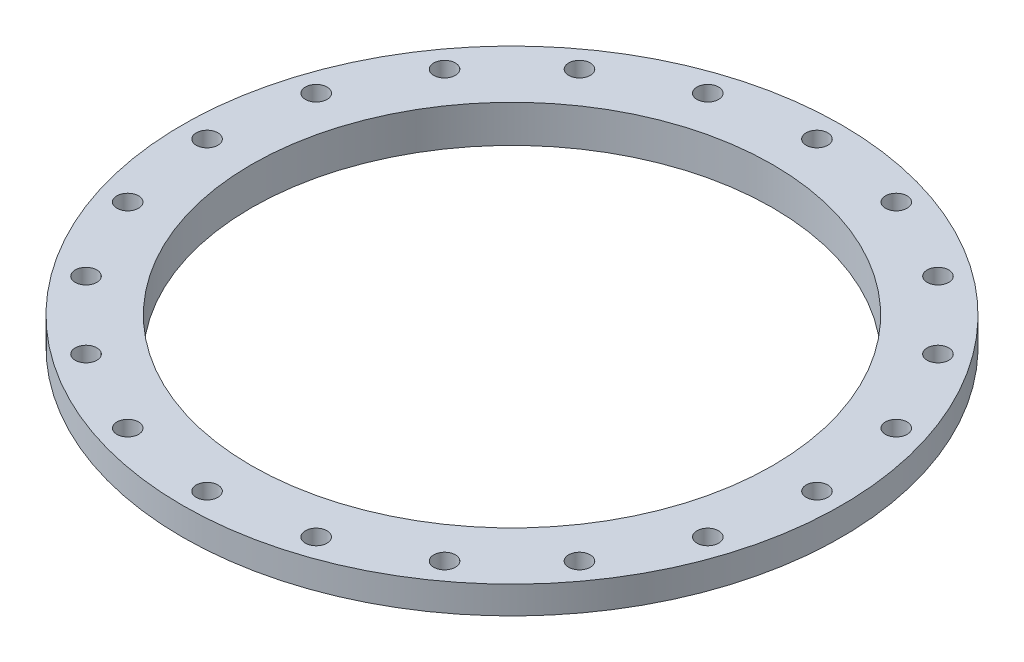
ISO-10303-21;
HEADER;
FILE_DESCRIPTION(('STEP AP214'),'2;1');
FILE_NAME('part.step','',(''),(''),'','','');
FILE_SCHEMA(('AUTOMOTIVE_DESIGN { 1 0 10303 214 1 1 1 1 }'));
ENDSEC;
DATA;
#1=APPLICATION_CONTEXT('core data for automotive mechanical design processes');
#2=APPLICATION_PROTOCOL_DEFINITION('international standard','automotive_design',2000,#1);
#3=PRODUCT_CONTEXT('',#1,'mechanical');
#4=PRODUCT('Part','Part','',(#3));
#5=PRODUCT_RELATED_PRODUCT_CATEGORY('part','',(#4));
#6=PRODUCT_DEFINITION_FORMATION('','',#4);
#7=PRODUCT_DEFINITION_CONTEXT('part definition',#1,'design');
#8=PRODUCT_DEFINITION('design','',#6,#7);
#9=PRODUCT_DEFINITION_SHAPE('','',#8);
#10=(LENGTH_UNIT() NAMED_UNIT(*) SI_UNIT(.MILLI.,.METRE.));
#11=(NAMED_UNIT(*) PLANE_ANGLE_UNIT() SI_UNIT($,.RADIAN.));
#12=(NAMED_UNIT(*) SI_UNIT($,.STERADIAN.) SOLID_ANGLE_UNIT());
#13=UNCERTAINTY_MEASURE_WITH_UNIT(LENGTH_MEASURE(1.E-05),#10,'distance_accuracy_value','');
#14=(GEOMETRIC_REPRESENTATION_CONTEXT(3) GLOBAL_UNCERTAINTY_ASSIGNED_CONTEXT((#13)) GLOBAL_UNIT_ASSIGNED_CONTEXT((#10,
#11,#12)) REPRESENTATION_CONTEXT('',''));
#15=CARTESIAN_POINT('',(0.,0.,0.));
#16=DIRECTION('',(0.,0.,1.));
#17=DIRECTION('',(1.,0.,0.));
#18=AXIS2_PLACEMENT_3D('',#15,#16,#17);
#19=CARTESIAN_POINT('',(0.,19.,-265.));
#20=DIRECTION('',(0.,1.,0.));
#21=DIRECTION('',(0.,0.,-1.));
#22=AXIS2_PLACEMENT_3D('',#19,#20,#21);
#23=PLANE('',#22);
#24=CARTESIAN_POINT('',(-294.827520051493,18.9999999999999,-95.7952682562064));
#25=DIRECTION('',(0.,1.,0.));
#26=DIRECTION('',(0.,0.,1.));
#27=AXIS2_PLACEMENT_3D('',#24,#25,#26);
#28=CIRCLE('',#27,11.);
#29=CARTESIAN_POINT('',(-294.827520051493,18.9999999999999,-84.7952682562064));
#30=VERTEX_POINT('',#29);
#31=EDGE_CURVE('E239',#30,#30,#28,.T.);
#32=ORIENTED_EDGE('',*,*,#31,.F.);
#33=EDGE_LOOP('',(#32));
#34=FACE_BOUND('',#33,.T.);
#35=CARTESIAN_POINT('',(-309.99999999999,18.9999999999999,3.16175115773912E-11));
#36=DIRECTION('',(0.,1.,0.));
#37=DIRECTION('',(0.,0.,1.));
#38=AXIS2_PLACEMENT_3D('',#35,#36,#37);
#39=CIRCLE('',#38,11.);
#40=CARTESIAN_POINT('',(-309.99999999999,18.9999999999999,11.0000000000317));
#41=VERTEX_POINT('',#40);
#42=EDGE_CURVE('E243',#41,#41,#39,.T.);
#43=ORIENTED_EDGE('',*,*,#42,.F.);
#44=EDGE_LOOP('',(#43));
#45=FACE_BOUND('',#44,.T.);
#46=CARTESIAN_POINT('',(-294.82752005148,18.9999999999999,95.7952682562676));
#47=DIRECTION('',(0.,1.,0.));
#48=DIRECTION('',(0.,0.,1.));
#49=AXIS2_PLACEMENT_3D('',#46,#47,#48);
#50=CIRCLE('',#49,11.);
#51=CARTESIAN_POINT('',(-294.82752005148,18.9999999999999,106.795268256268));
#52=VERTEX_POINT('',#51);
#53=EDGE_CURVE('E267',#52,#52,#50,.T.);
#54=ORIENTED_EDGE('',*,*,#53,.F.);
#55=EDGE_LOOP('',(#54));
#56=FACE_BOUND('',#55,.T.);
#57=CARTESIAN_POINT('',(-250.795268256209,18.9999999999999,182.213428210701));
#58=DIRECTION('',(0.,1.,0.));
#59=DIRECTION('',(0.,0.,1.));
#60=AXIS2_PLACEMENT_3D('',#57,#58,#59);
#61=CIRCLE('',#60,11.);
#62=CARTESIAN_POINT('',(-250.795268256209,18.9999999999999,193.213428210701));
#63=VERTEX_POINT('',#62);
#64=EDGE_CURVE('E264',#63,#63,#61,.T.);
#65=ORIENTED_EDGE('',*,*,#64,.F.);
#66=EDGE_LOOP('',(#65));
#67=FACE_BOUND('',#66,.T.);
#68=CARTESIAN_POINT('',(-182.213428210635,18.9999999999999,250.795268256265));
#69=DIRECTION('',(0.,1.,0.));
#70=DIRECTION('',(0.,0.,1.));
#71=AXIS2_PLACEMENT_3D('',#68,#69,#70);
#72=CIRCLE('',#71,11.);
#73=CARTESIAN_POINT('',(-182.213428210635,18.9999999999999,261.795268256265));
#74=VERTEX_POINT('',#73);
#75=EDGE_CURVE('E261',#74,#74,#72,.T.);
#76=ORIENTED_EDGE('',*,*,#75,.F.);
#77=EDGE_LOOP('',(#76));
#78=FACE_BOUND('',#77,.T.);
#79=CARTESIAN_POINT('',(-95.7952682561963,18.9999999999999,294.827520051525));
#80=DIRECTION('',(0.,1.,0.));
#81=DIRECTION('',(0.,0.,1.));
#82=AXIS2_PLACEMENT_3D('',#79,#80,#81);
#83=CIRCLE('',#82,11.);
#84=CARTESIAN_POINT('',(-95.7952682561963,18.9999999999999,305.827520051525));
#85=VERTEX_POINT('',#84);
#86=EDGE_CURVE('E258',#85,#85,#83,.T.);
#87=ORIENTED_EDGE('',*,*,#86,.F.);
#88=EDGE_LOOP('',(#87));
#89=FACE_BOUND('',#88,.T.);
#90=CARTESIAN_POINT('',(4.17618170672537E-11,18.9999999999999,310.000000000021));
#91=DIRECTION('',(0.,1.,0.));
#92=DIRECTION('',(0.,0.,1.));
#93=AXIS2_PLACEMENT_3D('',#90,#91,#92);
#94=CIRCLE('',#93,11.);
#95=CARTESIAN_POINT('',(4.17618170672537E-11,18.9999999999999,321.000000000021));
#96=VERTEX_POINT('',#95);
#97=EDGE_CURVE('E255',#96,#96,#94,.T.);
#98=ORIENTED_EDGE('',*,*,#97,.F.);
#99=EDGE_LOOP('',(#98));
#100=FACE_BOUND('',#99,.T.);
#101=CARTESIAN_POINT('',(95.7952682562777,18.9999999999999,294.827520051512));
#102=DIRECTION('',(0.,1.,0.));
#103=DIRECTION('',(0.,0.,1.));
#104=AXIS2_PLACEMENT_3D('',#101,#102,#103);
#105=CIRCLE('',#104,11.);
#106=CARTESIAN_POINT('',(95.7952682562777,18.9999999999999,305.827520051512));
#107=VERTEX_POINT('',#106);
#108=EDGE_CURVE('E251',#107,#107,#105,.T.);
#109=ORIENTED_EDGE('',*,*,#108,.F.);
#110=EDGE_LOOP('',(#109));
#111=FACE_BOUND('',#110,.T.);
#112=CARTESIAN_POINT('',(182.213428210711,18.9999999999999,250.795268256241));
#113=DIRECTION('',(0.,1.,0.));
#114=DIRECTION('',(0.,0.,1.));
#115=AXIS2_PLACEMENT_3D('',#112,#113,#114);
#116=CIRCLE('',#115,11.);
#117=CARTESIAN_POINT('',(182.213428210711,18.9999999999999,261.795268256241));
#118=VERTEX_POINT('',#117);
#119=EDGE_CURVE('E254',#118,#118,#116,.T.);
#120=ORIENTED_EDGE('',*,*,#119,.F.);
#121=EDGE_LOOP('',(#120));
#122=FACE_BOUND('',#121,.T.);
#123=CARTESIAN_POINT('',(250.795268256276,18.9999999999999,182.213428210667));
#124=DIRECTION('',(0.,1.,0.));
#125=DIRECTION('',(0.,0.,1.));
#126=AXIS2_PLACEMENT_3D('',#123,#124,#125);
#127=CIRCLE('',#126,11.);
#128=CARTESIAN_POINT('',(250.795268256276,18.9999999999999,193.213428210667));
#129=VERTEX_POINT('',#128);
#130=EDGE_CURVE('E290',#129,#129,#127,.T.);
#131=ORIENTED_EDGE('',*,*,#130,.F.);
#132=EDGE_LOOP('',(#131));
#133=FACE_BOUND('',#132,.T.);
#134=CARTESIAN_POINT('',(294.827520051535,18.9999999999999,95.7952682562279));
#135=DIRECTION('',(0.,1.,0.));
#136=DIRECTION('',(0.,0.,1.));
#137=AXIS2_PLACEMENT_3D('',#134,#135,#136);
#138=CIRCLE('',#137,11.);
#139=CARTESIAN_POINT('',(294.827520051535,18.9999999999999,106.795268256228));
#140=VERTEX_POINT('',#139);
#141=EDGE_CURVE('E287',#140,#140,#138,.T.);
#142=ORIENTED_EDGE('',*,*,#141,.F.);
#143=EDGE_LOOP('',(#142));
#144=FACE_BOUND('',#143,.T.);
#145=CARTESIAN_POINT('',(310.000000000032,18.9999999999999,-1.01740318252108E-11));
#146=DIRECTION('',(0.,1.,0.));
#147=DIRECTION('',(0.,0.,1.));
#148=AXIS2_PLACEMENT_3D('',#145,#146,#147);
#149=CIRCLE('',#148,11.);
#150=CARTESIAN_POINT('',(310.000000000032,18.9999999999999,10.9999999999899));
#151=VERTEX_POINT('',#150);
#152=EDGE_CURVE('E284',#151,#151,#149,.T.);
#153=ORIENTED_EDGE('',*,*,#152,.F.);
#154=EDGE_LOOP('',(#153));
#155=FACE_BOUND('',#154,.T.);
#156=CARTESIAN_POINT('',(294.827520051522,18.9999999999999,-95.7952682562462));
#157=DIRECTION('',(0.,1.,0.));
#158=DIRECTION('',(0.,0.,1.));
#159=AXIS2_PLACEMENT_3D('',#156,#157,#158);
#160=CIRCLE('',#159,11.);
#161=CARTESIAN_POINT('',(294.827520051522,18.9999999999999,-84.7952682562461));
#162=VERTEX_POINT('',#161);
#163=EDGE_CURVE('E281',#162,#162,#160,.T.);
#164=ORIENTED_EDGE('',*,*,#163,.F.);
#165=EDGE_LOOP('',(#164));
#166=FACE_BOUND('',#165,.T.);
#167=CARTESIAN_POINT('',(250.795268256251,18.9999999999999,-182.213428210679));
#168=DIRECTION('',(0.,1.,0.));
#169=DIRECTION('',(0.,0.,1.));
#170=AXIS2_PLACEMENT_3D('',#167,#168,#169);
#171=CIRCLE('',#170,11.);
#172=CARTESIAN_POINT('',(250.795268256251,18.9999999999999,-171.213428210679));
#173=VERTEX_POINT('',#172);
#174=EDGE_CURVE('E278',#173,#173,#171,.T.);
#175=ORIENTED_EDGE('',*,*,#174,.F.);
#176=EDGE_LOOP('',(#175));
#177=FACE_BOUND('',#176,.T.);
#178=CARTESIAN_POINT('',(182.213428210677,18.9999999999999,-250.795268256244));
#179=DIRECTION('',(0.,1.,0.));
#180=DIRECTION('',(0.,0.,1.));
#181=AXIS2_PLACEMENT_3D('',#178,#179,#180);
#182=CIRCLE('',#181,11.);
#183=CARTESIAN_POINT('',(182.213428210677,18.9999999999999,-239.795268256244));
#184=VERTEX_POINT('',#183);
#185=EDGE_CURVE('E275',#184,#184,#182,.T.);
#186=ORIENTED_EDGE('',*,*,#185,.F.);
#187=EDGE_LOOP('',(#186));
#188=FACE_BOUND('',#187,.T.);
#189=CARTESIAN_POINT('',(95.795268256234,18.9999999999999,-294.827520051498));
#190=DIRECTION('',(0.,1.,0.));
#191=DIRECTION('',(0.,0.,1.));
#192=AXIS2_PLACEMENT_3D('',#189,#190,#191);
#193=CIRCLE('',#192,11.);
#194=CARTESIAN_POINT('',(95.795268256234,18.9999999999999,-283.827520051498));
#195=VERTEX_POINT('',#194);
#196=EDGE_CURVE('E272',#195,#195,#193,.T.);
#197=ORIENTED_EDGE('',*,*,#196,.F.);
#198=EDGE_LOOP('',(#197));
#199=FACE_BOUND('',#198,.T.);
#200=CARTESIAN_POINT('',(-250.795268256234,18.9999999999999,-182.213428210645));
#201=DIRECTION('',(0.,1.,0.));
#202=DIRECTION('',(0.,0.,1.));
#203=AXIS2_PLACEMENT_3D('',#200,#201,#202);
#204=CIRCLE('',#203,11.);
#205=CARTESIAN_POINT('',(-250.795268256234,18.9999999999999,-171.213428210645));
#206=VERTEX_POINT('',#205);
#207=EDGE_CURVE('E237',#206,#206,#204,.T.);
#208=ORIENTED_EDGE('',*,*,#207,.F.);
#209=EDGE_LOOP('',(#208));
#210=FACE_BOUND('',#209,.T.);
#211=CARTESIAN_POINT('',(-182.213428210669,18.9999999999999,-250.795268256219));
#212=DIRECTION('',(0.,1.,0.));
#213=DIRECTION('',(0.,0.,1.));
#214=AXIS2_PLACEMENT_3D('',#211,#212,#213);
#215=CIRCLE('',#214,11.);
#216=CARTESIAN_POINT('',(-182.213428210669,18.9999999999999,-239.795268256219));
#217=VERTEX_POINT('',#216);
#218=EDGE_CURVE('E240',#217,#217,#215,.T.);
#219=ORIENTED_EDGE('',*,*,#218,.F.);
#220=EDGE_LOOP('',(#219));
#221=FACE_BOUND('',#220,.T.);
#222=CARTESIAN_POINT('',(-95.795268256236,18.9999999999999,-294.827520051491));
#223=DIRECTION('',(0.,1.,0.));
#224=DIRECTION('',(0.,0.,1.));
#225=AXIS2_PLACEMENT_3D('',#222,#223,#224);
#226=CIRCLE('',#225,11.);
#227=CARTESIAN_POINT('',(-95.795268256236,18.9999999999999,-283.827520051491));
#228=VERTEX_POINT('',#227);
#229=EDGE_CURVE('E246',#228,#228,#226,.T.);
#230=ORIENTED_EDGE('',*,*,#229,.F.);
#231=EDGE_LOOP('',(#230));
#232=FACE_BOUND('',#231,.T.);
#233=CARTESIAN_POINT('',(0.,18.9999999999999,-310.));
#234=DIRECTION('',(0.,1.,0.));
#235=DIRECTION('',(0.,0.,1.));
#236=AXIS2_PLACEMENT_3D('',#233,#234,#235);
#237=CIRCLE('',#236,11.);
#238=CARTESIAN_POINT('',(0.,18.9999999999999,-299.));
#239=VERTEX_POINT('',#238);
#240=EDGE_CURVE('E53',#239,#239,#237,.T.);
#241=ORIENTED_EDGE('',*,*,#240,.F.);
#242=EDGE_LOOP('',(#241));
#243=FACE_BOUND('',#242,.T.);
#244=CARTESIAN_POINT('',(0.,18.9999999999999,0.));
#245=DIRECTION('',(0.,-1.,0.));
#246=DIRECTION('',(0.,0.,-1.));
#247=AXIS2_PLACEMENT_3D('',#244,#245,#246);
#248=CIRCLE('',#247,335.);
#249=CARTESIAN_POINT('',(0.,18.9999999999999,-335.));
#250=VERTEX_POINT('',#249);
#251=EDGE_CURVE('E10',#250,#250,#248,.T.);
#252=ORIENTED_EDGE('',*,*,#251,.F.);
#253=EDGE_LOOP('',(#252));
#254=FACE_BOUND('',#253,.T.);
#255=CARTESIAN_POINT('',(0.,18.9999999999999,0.));
#256=DIRECTION('',(0.,-1.,0.));
#257=DIRECTION('',(0.,0.,-1.));
#258=AXIS2_PLACEMENT_3D('',#255,#256,#257);
#259=CIRCLE('',#258,265.);
#260=CARTESIAN_POINT('',(0.,18.9999999999999,-265.));
#261=VERTEX_POINT('',#260);
#262=EDGE_CURVE('E108',#261,#261,#259,.T.);
#263=ORIENTED_EDGE('',*,*,#262,.T.);
#264=EDGE_LOOP('',(#263));
#265=FACE_BOUND('',#264,.T.);
#266=ADVANCED_FACE('F33',(#34,#45,#56,#67,#78,#89,#100,#111,#122,#133,#144,#155,#166,#177,#188,
#199,#210,#221,#232,#243,#254,#265),#23,.T.);
#267=CARTESIAN_POINT('',(0.,1813.31659334197,0.));
#268=DIRECTION('',(0.,1.,0.));
#269=DIRECTION('',(0.,0.,-1.));
#270=AXIS2_PLACEMENT_3D('',#267,#268,#269);
#271=CYLINDRICAL_SURFACE('',#270,335.);
#272=CARTESIAN_POINT('',(0.,-8.9999999999999,0.));
#273=DIRECTION('',(0.,-1.,0.));
#274=DIRECTION('',(0.,0.,-1.));
#275=AXIS2_PLACEMENT_3D('',#272,#273,#274);
#276=CIRCLE('',#275,335.);
#277=CARTESIAN_POINT('',(0.,-8.9999999999999,-335.));
#278=VERTEX_POINT('',#277);
#279=EDGE_CURVE('E40',#278,#278,#276,.T.);
#280=ORIENTED_EDGE('',*,*,#279,.F.);
#281=EDGE_LOOP('',(#280));
#282=FACE_BOUND('',#281,.T.);
#283=ORIENTED_EDGE('',*,*,#251,.T.);
#284=EDGE_LOOP('',(#283));
#285=FACE_BOUND('',#284,.T.);
#286=ADVANCED_FACE('F131',(#282,#285),#271,.T.);
#287=CARTESIAN_POINT('',(0.,-9.,-335.));
#288=DIRECTION('',(0.,-1.,0.));
#289=DIRECTION('',(0.,0.,1.));
#290=AXIS2_PLACEMENT_3D('',#287,#288,#289);
#291=PLANE('',#290);
#292=CARTESIAN_POINT('',(-294.827520051493,-9.,-95.7952682562064));
#293=DIRECTION('',(0.,1.,0.));
#294=DIRECTION('',(0.,0.,1.));
#295=AXIS2_PLACEMENT_3D('',#292,#293,#294);
#296=CIRCLE('',#295,11.);
#297=CARTESIAN_POINT('',(-294.827520051493,-9.,-84.7952682562064));
#298=VERTEX_POINT('',#297);
#299=EDGE_CURVE('E36',#298,#298,#296,.T.);
#300=ORIENTED_EDGE('',*,*,#299,.T.);
#301=EDGE_LOOP('',(#300));
#302=FACE_BOUND('',#301,.T.);
#303=CARTESIAN_POINT('',(-309.99999999999,-9.,3.16175115773912E-11));
#304=DIRECTION('',(0.,1.,0.));
#305=DIRECTION('',(0.,0.,1.));
#306=AXIS2_PLACEMENT_3D('',#303,#304,#305);
#307=CIRCLE('',#306,11.);
#308=CARTESIAN_POINT('',(-309.99999999999,-9.,11.0000000000317));
#309=VERTEX_POINT('',#308);
#310=EDGE_CURVE('E103',#309,#309,#307,.T.);
#311=ORIENTED_EDGE('',*,*,#310,.T.);
#312=EDGE_LOOP('',(#311));
#313=FACE_BOUND('',#312,.T.);
#314=CARTESIAN_POINT('',(-294.82752005148,-9.,95.7952682562676));
#315=DIRECTION('',(0.,1.,0.));
#316=DIRECTION('',(0.,0.,1.));
#317=AXIS2_PLACEMENT_3D('',#314,#315,#316);
#318=CIRCLE('',#317,11.);
#319=CARTESIAN_POINT('',(-294.82752005148,-9.,106.795268256268));
#320=VERTEX_POINT('',#319);
#321=EDGE_CURVE('E101',#320,#320,#318,.T.);
#322=ORIENTED_EDGE('',*,*,#321,.T.);
#323=EDGE_LOOP('',(#322));
#324=FACE_BOUND('',#323,.T.);
#325=CARTESIAN_POINT('',(-250.795268256209,-9.,182.213428210701));
#326=DIRECTION('',(0.,1.,0.));
#327=DIRECTION('',(0.,0.,1.));
#328=AXIS2_PLACEMENT_3D('',#325,#326,#327);
#329=CIRCLE('',#328,11.);
#330=CARTESIAN_POINT('',(-250.795268256209,-9.,193.213428210701));
#331=VERTEX_POINT('',#330);
#332=EDGE_CURVE('E98',#331,#331,#329,.T.);
#333=ORIENTED_EDGE('',*,*,#332,.T.);
#334=EDGE_LOOP('',(#333));
#335=FACE_BOUND('',#334,.T.);
#336=CARTESIAN_POINT('',(-182.213428210635,-9.,250.795268256265));
#337=DIRECTION('',(0.,1.,0.));
#338=DIRECTION('',(0.,0.,1.));
#339=AXIS2_PLACEMENT_3D('',#336,#337,#338);
#340=CIRCLE('',#339,11.);
#341=CARTESIAN_POINT('',(-182.213428210635,-9.,261.795268256265));
#342=VERTEX_POINT('',#341);
#343=EDGE_CURVE('E95',#342,#342,#340,.T.);
#344=ORIENTED_EDGE('',*,*,#343,.T.);
#345=EDGE_LOOP('',(#344));
#346=FACE_BOUND('',#345,.T.);
#347=CARTESIAN_POINT('',(-95.7952682561963,-9.,294.827520051525));
#348=DIRECTION('',(0.,1.,0.));
#349=DIRECTION('',(0.,0.,1.));
#350=AXIS2_PLACEMENT_3D('',#347,#348,#349);
#351=CIRCLE('',#350,11.);
#352=CARTESIAN_POINT('',(-95.7952682561963,-9.,305.827520051525));
#353=VERTEX_POINT('',#352);
#354=EDGE_CURVE('E92',#353,#353,#351,.T.);
#355=ORIENTED_EDGE('',*,*,#354,.T.);
#356=EDGE_LOOP('',(#355));
#357=FACE_BOUND('',#356,.T.);
#358=CARTESIAN_POINT('',(4.17618170672537E-11,-9.,310.000000000021));
#359=DIRECTION('',(0.,1.,0.));
#360=DIRECTION('',(0.,0.,1.));
#361=AXIS2_PLACEMENT_3D('',#358,#359,#360);
#362=CIRCLE('',#361,11.);
#363=CARTESIAN_POINT('',(4.17618170672537E-11,-9.,321.000000000021));
#364=VERTEX_POINT('',#363);
#365=EDGE_CURVE('E89',#364,#364,#362,.T.);
#366=ORIENTED_EDGE('',*,*,#365,.T.);
#367=EDGE_LOOP('',(#366));
#368=FACE_BOUND('',#367,.T.);
#369=CARTESIAN_POINT('',(95.7952682562777,-9.,294.827520051512));
#370=DIRECTION('',(0.,1.,0.));
#371=DIRECTION('',(0.,0.,1.));
#372=AXIS2_PLACEMENT_3D('',#369,#370,#371);
#373=CIRCLE('',#372,11.);
#374=CARTESIAN_POINT('',(95.7952682562777,-9.,305.827520051512));
#375=VERTEX_POINT('',#374);
#376=EDGE_CURVE('E86',#375,#375,#373,.T.);
#377=ORIENTED_EDGE('',*,*,#376,.T.);
#378=EDGE_LOOP('',(#377));
#379=FACE_BOUND('',#378,.T.);
#380=CARTESIAN_POINT('',(182.213428210711,-9.,250.795268256241));
#381=DIRECTION('',(0.,1.,0.));
#382=DIRECTION('',(0.,0.,1.));
#383=AXIS2_PLACEMENT_3D('',#380,#381,#382);
#384=CIRCLE('',#383,11.);
#385=CARTESIAN_POINT('',(182.213428210711,-9.,261.795268256241));
#386=VERTEX_POINT('',#385);
#387=EDGE_CURVE('E83',#386,#386,#384,.T.);
#388=ORIENTED_EDGE('',*,*,#387,.T.);
#389=EDGE_LOOP('',(#388));
#390=FACE_BOUND('',#389,.T.);
#391=CARTESIAN_POINT('',(250.795268256276,-9.,182.213428210667));
#392=DIRECTION('',(0.,1.,0.));
#393=DIRECTION('',(0.,0.,1.));
#394=AXIS2_PLACEMENT_3D('',#391,#392,#393);
#395=CIRCLE('',#394,11.);
#396=CARTESIAN_POINT('',(250.795268256276,-9.,193.213428210667));
#397=VERTEX_POINT('',#396);
#398=EDGE_CURVE('E80',#397,#397,#395,.T.);
#399=ORIENTED_EDGE('',*,*,#398,.T.);
#400=EDGE_LOOP('',(#399));
#401=FACE_BOUND('',#400,.T.);
#402=CARTESIAN_POINT('',(294.827520051535,-9.,95.7952682562279));
#403=DIRECTION('',(0.,1.,0.));
#404=DIRECTION('',(0.,0.,1.));
#405=AXIS2_PLACEMENT_3D('',#402,#403,#404);
#406=CIRCLE('',#405,11.);
#407=CARTESIAN_POINT('',(294.827520051535,-9.,106.795268256228));
#408=VERTEX_POINT('',#407);
#409=EDGE_CURVE('E77',#408,#408,#406,.T.);
#410=ORIENTED_EDGE('',*,*,#409,.T.);
#411=EDGE_LOOP('',(#410));
#412=FACE_BOUND('',#411,.T.);
#413=CARTESIAN_POINT('',(310.000000000032,-9.,-1.01740318252108E-11));
#414=DIRECTION('',(0.,1.,0.));
#415=DIRECTION('',(0.,0.,1.));
#416=AXIS2_PLACEMENT_3D('',#413,#414,#415);
#417=CIRCLE('',#416,11.);
#418=CARTESIAN_POINT('',(310.000000000032,-9.,10.9999999999899));
#419=VERTEX_POINT('',#418);
#420=EDGE_CURVE('E74',#419,#419,#417,.T.);
#421=ORIENTED_EDGE('',*,*,#420,.T.);
#422=EDGE_LOOP('',(#421));
#423=FACE_BOUND('',#422,.T.);
#424=CARTESIAN_POINT('',(294.827520051522,-9.,-95.7952682562462));
#425=DIRECTION('',(0.,1.,0.));
#426=DIRECTION('',(0.,0.,1.));
#427=AXIS2_PLACEMENT_3D('',#424,#425,#426);
#428=CIRCLE('',#427,11.);
#429=CARTESIAN_POINT('',(294.827520051522,-9.,-84.7952682562461));
#430=VERTEX_POINT('',#429);
#431=EDGE_CURVE('E71',#430,#430,#428,.T.);
#432=ORIENTED_EDGE('',*,*,#431,.T.);
#433=EDGE_LOOP('',(#432));
#434=FACE_BOUND('',#433,.T.);
#435=CARTESIAN_POINT('',(250.795268256251,-9.,-182.213428210679));
#436=DIRECTION('',(0.,1.,0.));
#437=DIRECTION('',(0.,0.,1.));
#438=AXIS2_PLACEMENT_3D('',#435,#436,#437);
#439=CIRCLE('',#438,11.);
#440=CARTESIAN_POINT('',(250.795268256251,-9.,-171.213428210679));
#441=VERTEX_POINT('',#440);
#442=EDGE_CURVE('E68',#441,#441,#439,.T.);
#443=ORIENTED_EDGE('',*,*,#442,.T.);
#444=EDGE_LOOP('',(#443));
#445=FACE_BOUND('',#444,.T.);
#446=CARTESIAN_POINT('',(182.213428210677,-9.,-250.795268256244));
#447=DIRECTION('',(0.,1.,0.));
#448=DIRECTION('',(0.,0.,1.));
#449=AXIS2_PLACEMENT_3D('',#446,#447,#448);
#450=CIRCLE('',#449,11.);
#451=CARTESIAN_POINT('',(182.213428210677,-9.,-239.795268256244));
#452=VERTEX_POINT('',#451);
#453=EDGE_CURVE('E65',#452,#452,#450,.T.);
#454=ORIENTED_EDGE('',*,*,#453,.T.);
#455=EDGE_LOOP('',(#454));
#456=FACE_BOUND('',#455,.T.);
#457=CARTESIAN_POINT('',(95.795268256234,-9.,-294.827520051498));
#458=DIRECTION('',(0.,1.,0.));
#459=DIRECTION('',(0.,0.,1.));
#460=AXIS2_PLACEMENT_3D('',#457,#458,#459);
#461=CIRCLE('',#460,11.);
#462=CARTESIAN_POINT('',(95.795268256234,-9.,-283.827520051498));
#463=VERTEX_POINT('',#462);
#464=EDGE_CURVE('E62',#463,#463,#461,.T.);
#465=ORIENTED_EDGE('',*,*,#464,.T.);
#466=EDGE_LOOP('',(#465));
#467=FACE_BOUND('',#466,.T.);
#468=CARTESIAN_POINT('',(-250.795268256234,-9.,-182.213428210645));
#469=DIRECTION('',(0.,1.,0.));
#470=DIRECTION('',(0.,0.,1.));
#471=AXIS2_PLACEMENT_3D('',#468,#469,#470);
#472=CIRCLE('',#471,11.);
#473=CARTESIAN_POINT('',(-250.795268256234,-9.,-171.213428210645));
#474=VERTEX_POINT('',#473);
#475=EDGE_CURVE('E59',#474,#474,#472,.T.);
#476=ORIENTED_EDGE('',*,*,#475,.T.);
#477=EDGE_LOOP('',(#476));
#478=FACE_BOUND('',#477,.T.);
#479=CARTESIAN_POINT('',(-182.213428210669,-9.,-250.795268256219));
#480=DIRECTION('',(0.,1.,0.));
#481=DIRECTION('',(0.,0.,1.));
#482=AXIS2_PLACEMENT_3D('',#479,#480,#481);
#483=CIRCLE('',#482,11.);
#484=CARTESIAN_POINT('',(-182.213428210669,-9.,-239.795268256219));
#485=VERTEX_POINT('',#484);
#486=EDGE_CURVE('E56',#485,#485,#483,.T.);
#487=ORIENTED_EDGE('',*,*,#486,.T.);
#488=EDGE_LOOP('',(#487));
#489=FACE_BOUND('',#488,.T.);
#490=CARTESIAN_POINT('',(-95.795268256236,-9.,-294.827520051491));
#491=DIRECTION('',(0.,1.,0.));
#492=DIRECTION('',(0.,0.,1.));
#493=AXIS2_PLACEMENT_3D('',#490,#491,#492);
#494=CIRCLE('',#493,11.);
#495=CARTESIAN_POINT('',(-95.795268256236,-9.,-283.827520051491));
#496=VERTEX_POINT('',#495);
#497=EDGE_CURVE('E52',#496,#496,#494,.T.);
#498=ORIENTED_EDGE('',*,*,#497,.T.);
#499=EDGE_LOOP('',(#498));
#500=FACE_BOUND('',#499,.T.);
#501=CARTESIAN_POINT('',(0.,-9.,-310.));
#502=DIRECTION('',(0.,1.,0.));
#503=DIRECTION('',(0.,0.,1.));
#504=AXIS2_PLACEMENT_3D('',#501,#502,#503);
#505=CIRCLE('',#504,11.);
#506=CARTESIAN_POINT('',(0.,-9.,-299.));
#507=VERTEX_POINT('',#506);
#508=EDGE_CURVE('E49',#507,#507,#505,.T.);
#509=ORIENTED_EDGE('',*,*,#508,.T.);
#510=EDGE_LOOP('',(#509));
#511=FACE_BOUND('',#510,.T.);
#512=CARTESIAN_POINT('',(0.,-8.9999999999999,0.));
#513=DIRECTION('',(0.,-1.,0.));
#514=DIRECTION('',(0.,0.,-1.));
#515=AXIS2_PLACEMENT_3D('',#512,#513,#514);
#516=CIRCLE('',#515,296.139702342662);
#517=CARTESIAN_POINT('',(0.,-8.9999999999999,-296.139702342662));
#518=VERTEX_POINT('',#517);
#519=EDGE_CURVE('E45',#518,#518,#516,.T.);
#520=ORIENTED_EDGE('',*,*,#519,.F.);
#521=EDGE_LOOP('',(#520));
#522=FACE_BOUND('',#521,.T.);
#523=ORIENTED_EDGE('',*,*,#279,.T.);
#524=EDGE_LOOP('',(#523));
#525=FACE_BOUND('',#524,.T.);
#526=ADVANCED_FACE('F128',(#302,#313,#324,#335,#346,#357,#368,#379,#390,#401,#412,#423,#434,
#445,#456,#467,#478,#489,#500,#511,#522,#525),#291,.T.);
#527=CARTESIAN_POINT('',(0.,-8.9999999999999,0.));
#528=DIRECTION('',(0.,1.,0.));
#529=DIRECTION('',(0.,0.,-1.));
#530=AXIS2_PLACEMENT_3D('',#527,#528,#529);
#531=CONICAL_SURFACE('',#530,296.139702342662,0.349065850398862);
#532=CARTESIAN_POINT('',(0.,-18.9999999999999,0.));
#533=DIRECTION('',(0.,-1.,0.));
#534=DIRECTION('',(0.,0.,-1.));
#535=AXIS2_PLACEMENT_3D('',#532,#533,#534);
#536=CIRCLE('',#535,292.5);
#537=CARTESIAN_POINT('',(0.,-18.9999999999999,-292.5));
#538=VERTEX_POINT('',#537);
#539=EDGE_CURVE('E117',#538,#538,#536,.T.);
#540=ORIENTED_EDGE('',*,*,#539,.F.);
#541=EDGE_LOOP('',(#540));
#542=FACE_BOUND('',#541,.T.);
#543=ORIENTED_EDGE('',*,*,#519,.T.);
#544=EDGE_LOOP('',(#543));
#545=FACE_BOUND('',#544,.T.);
#546=ADVANCED_FACE('F126',(#542,#545),#531,.T.);
#547=CARTESIAN_POINT('',(0.,-19.,-292.5));
#548=DIRECTION('',(0.,-1.,0.));
#549=DIRECTION('',(0.,0.,1.));
#550=AXIS2_PLACEMENT_3D('',#547,#548,#549);
#551=PLANE('',#550);
#552=CARTESIAN_POINT('',(0.,-18.9999999999999,0.));
#553=DIRECTION('',(0.,-1.,0.));
#554=DIRECTION('',(0.,0.,-1.));
#555=AXIS2_PLACEMENT_3D('',#552,#553,#554);
#556=CIRCLE('',#555,265.);
#557=CARTESIAN_POINT('',(0.,-18.9999999999999,-265.));
#558=VERTEX_POINT('',#557);
#559=EDGE_CURVE('E112',#558,#558,#556,.T.);
#560=ORIENTED_EDGE('',*,*,#559,.F.);
#561=EDGE_LOOP('',(#560));
#562=FACE_BOUND('',#561,.T.);
#563=ORIENTED_EDGE('',*,*,#539,.T.);
#564=EDGE_LOOP('',(#563));
#565=FACE_BOUND('',#564,.T.);
#566=ADVANCED_FACE('F143',(#562,#565),#551,.T.);
#567=CARTESIAN_POINT('',(0.,1813.31659334197,0.));
#568=DIRECTION('',(0.,1.,0.));
#569=DIRECTION('',(0.,0.,-1.));
#570=AXIS2_PLACEMENT_3D('',#567,#568,#569);
#571=CYLINDRICAL_SURFACE('',#570,265.);
#572=ORIENTED_EDGE('',*,*,#262,.F.);
#573=EDGE_LOOP('',(#572));
#574=FACE_BOUND('',#573,.T.);
#575=ORIENTED_EDGE('',*,*,#559,.T.);
#576=EDGE_LOOP('',(#575));
#577=FACE_BOUND('',#576,.T.);
#578=ADVANCED_FACE('F147',(#574,#577),#571,.F.);
#579=CARTESIAN_POINT('',(0.,18.9999999999999,-310.));
#580=DIRECTION('',(0.,-1.,0.));
#581=DIRECTION('',(0.,0.,1.));
#582=AXIS2_PLACEMENT_3D('',#579,#580,#581);
#583=CYLINDRICAL_SURFACE('',#582,11.);
#584=ORIENTED_EDGE('',*,*,#508,.F.);
#585=EDGE_LOOP('',(#584));
#586=FACE_BOUND('',#585,.T.);
#587=ORIENTED_EDGE('',*,*,#240,.T.);
#588=EDGE_LOOP('',(#587));
#589=FACE_BOUND('',#588,.T.);
#590=ADVANCED_FACE('F151',(#586,#589),#583,.F.);
#591=CARTESIAN_POINT('',(-95.795268256236,18.9999999999999,-294.827520051491));
#592=DIRECTION('',(0.,-1.,0.));
#593=DIRECTION('',(0.,0.,1.));
#594=AXIS2_PLACEMENT_3D('',#591,#592,#593);
#595=CYLINDRICAL_SURFACE('',#594,11.);
#596=ORIENTED_EDGE('',*,*,#497,.F.);
#597=EDGE_LOOP('',(#596));
#598=FACE_BOUND('',#597,.T.);
#599=ORIENTED_EDGE('',*,*,#229,.T.);
#600=EDGE_LOOP('',(#599));
#601=FACE_BOUND('',#600,.T.);
#602=ADVANCED_FACE('F155',(#598,#601),#595,.F.);
#603=CARTESIAN_POINT('',(-182.213428210669,18.9999999999999,-250.795268256219));
#604=DIRECTION('',(0.,-1.,0.));
#605=DIRECTION('',(0.,0.,1.));
#606=AXIS2_PLACEMENT_3D('',#603,#604,#605);
#607=CYLINDRICAL_SURFACE('',#606,11.);
#608=ORIENTED_EDGE('',*,*,#486,.F.);
#609=EDGE_LOOP('',(#608));
#610=FACE_BOUND('',#609,.T.);
#611=ORIENTED_EDGE('',*,*,#218,.T.);
#612=EDGE_LOOP('',(#611));
#613=FACE_BOUND('',#612,.T.);
#614=ADVANCED_FACE('F224',(#610,#613),#607,.F.);
#615=CARTESIAN_POINT('',(-250.795268256234,18.9999999999999,-182.213428210645));
#616=DIRECTION('',(0.,-1.,0.));
#617=DIRECTION('',(0.,0.,1.));
#618=AXIS2_PLACEMENT_3D('',#615,#616,#617);
#619=CYLINDRICAL_SURFACE('',#618,11.);
#620=ORIENTED_EDGE('',*,*,#475,.F.);
#621=EDGE_LOOP('',(#620));
#622=FACE_BOUND('',#621,.T.);
#623=ORIENTED_EDGE('',*,*,#207,.T.);
#624=EDGE_LOOP('',(#623));
#625=FACE_BOUND('',#624,.T.);
#626=ADVANCED_FACE('F189',(#622,#625),#619,.F.);
#627=CARTESIAN_POINT('',(95.795268256234,18.9999999999999,-294.827520051498));
#628=DIRECTION('',(0.,-1.,0.));
#629=DIRECTION('',(0.,0.,1.));
#630=AXIS2_PLACEMENT_3D('',#627,#628,#629);
#631=CYLINDRICAL_SURFACE('',#630,11.);
#632=ORIENTED_EDGE('',*,*,#464,.F.);
#633=EDGE_LOOP('',(#632));
#634=FACE_BOUND('',#633,.T.);
#635=ORIENTED_EDGE('',*,*,#196,.T.);
#636=EDGE_LOOP('',(#635));
#637=FACE_BOUND('',#636,.T.);
#638=ADVANCED_FACE('F185',(#634,#637),#631,.F.);
#639=CARTESIAN_POINT('',(182.213428210677,18.9999999999999,-250.795268256244));
#640=DIRECTION('',(0.,-1.,0.));
#641=DIRECTION('',(0.,0.,1.));
#642=AXIS2_PLACEMENT_3D('',#639,#640,#641);
#643=CYLINDRICAL_SURFACE('',#642,11.);
#644=ORIENTED_EDGE('',*,*,#453,.F.);
#645=EDGE_LOOP('',(#644));
#646=FACE_BOUND('',#645,.T.);
#647=ORIENTED_EDGE('',*,*,#185,.T.);
#648=EDGE_LOOP('',(#647));
#649=FACE_BOUND('',#648,.T.);
#650=ADVANCED_FACE('F181',(#646,#649),#643,.F.);
#651=CARTESIAN_POINT('',(250.795268256251,18.9999999999999,-182.213428210679));
#652=DIRECTION('',(0.,-1.,0.));
#653=DIRECTION('',(0.,0.,1.));
#654=AXIS2_PLACEMENT_3D('',#651,#652,#653);
#655=CYLINDRICAL_SURFACE('',#654,11.);
#656=ORIENTED_EDGE('',*,*,#442,.F.);
#657=EDGE_LOOP('',(#656));
#658=FACE_BOUND('',#657,.T.);
#659=ORIENTED_EDGE('',*,*,#174,.T.);
#660=EDGE_LOOP('',(#659));
#661=FACE_BOUND('',#660,.T.);
#662=ADVANCED_FACE('F177',(#658,#661),#655,.F.);
#663=CARTESIAN_POINT('',(294.827520051522,18.9999999999999,-95.7952682562462));
#664=DIRECTION('',(0.,-1.,0.));
#665=DIRECTION('',(0.,0.,1.));
#666=AXIS2_PLACEMENT_3D('',#663,#664,#665);
#667=CYLINDRICAL_SURFACE('',#666,11.);
#668=ORIENTED_EDGE('',*,*,#431,.F.);
#669=EDGE_LOOP('',(#668));
#670=FACE_BOUND('',#669,.T.);
#671=ORIENTED_EDGE('',*,*,#163,.T.);
#672=EDGE_LOOP('',(#671));
#673=FACE_BOUND('',#672,.T.);
#674=ADVANCED_FACE('F173',(#670,#673),#667,.F.);
#675=CARTESIAN_POINT('',(310.000000000032,18.9999999999999,-1.01740318252108E-11));
#676=DIRECTION('',(0.,-1.,0.));
#677=DIRECTION('',(0.,0.,1.));
#678=AXIS2_PLACEMENT_3D('',#675,#676,#677);
#679=CYLINDRICAL_SURFACE('',#678,11.);
#680=ORIENTED_EDGE('',*,*,#420,.F.);
#681=EDGE_LOOP('',(#680));
#682=FACE_BOUND('',#681,.T.);
#683=ORIENTED_EDGE('',*,*,#152,.T.);
#684=EDGE_LOOP('',(#683));
#685=FACE_BOUND('',#684,.T.);
#686=ADVANCED_FACE('F169',(#682,#685),#679,.F.);
#687=CARTESIAN_POINT('',(294.827520051535,18.9999999999999,95.7952682562279));
#688=DIRECTION('',(0.,-1.,0.));
#689=DIRECTION('',(0.,0.,1.));
#690=AXIS2_PLACEMENT_3D('',#687,#688,#689);
#691=CYLINDRICAL_SURFACE('',#690,11.);
#692=ORIENTED_EDGE('',*,*,#409,.F.);
#693=EDGE_LOOP('',(#692));
#694=FACE_BOUND('',#693,.T.);
#695=ORIENTED_EDGE('',*,*,#141,.T.);
#696=EDGE_LOOP('',(#695));
#697=FACE_BOUND('',#696,.T.);
#698=ADVANCED_FACE('F165',(#694,#697),#691,.F.);
#699=CARTESIAN_POINT('',(250.795268256276,18.9999999999999,182.213428210667));
#700=DIRECTION('',(0.,-1.,0.));
#701=DIRECTION('',(0.,0.,1.));
#702=AXIS2_PLACEMENT_3D('',#699,#700,#701);
#703=CYLINDRICAL_SURFACE('',#702,11.);
#704=ORIENTED_EDGE('',*,*,#398,.F.);
#705=EDGE_LOOP('',(#704));
#706=FACE_BOUND('',#705,.T.);
#707=ORIENTED_EDGE('',*,*,#130,.T.);
#708=EDGE_LOOP('',(#707));
#709=FACE_BOUND('',#708,.T.);
#710=ADVANCED_FACE('F161',(#706,#709),#703,.F.);
#711=CARTESIAN_POINT('',(182.213428210711,18.9999999999999,250.795268256241));
#712=DIRECTION('',(0.,-1.,0.));
#713=DIRECTION('',(0.,0.,1.));
#714=AXIS2_PLACEMENT_3D('',#711,#712,#713);
#715=CYLINDRICAL_SURFACE('',#714,11.);
#716=ORIENTED_EDGE('',*,*,#387,.F.);
#717=EDGE_LOOP('',(#716));
#718=FACE_BOUND('',#717,.T.);
#719=ORIENTED_EDGE('',*,*,#119,.T.);
#720=EDGE_LOOP('',(#719));
#721=FACE_BOUND('',#720,.T.);
#722=ADVANCED_FACE('F157',(#718,#721),#715,.F.);
#723=CARTESIAN_POINT('',(95.7952682562777,18.9999999999999,294.827520051512));
#724=DIRECTION('',(0.,-1.,0.));
#725=DIRECTION('',(0.,0.,1.));
#726=AXIS2_PLACEMENT_3D('',#723,#724,#725);
#727=CYLINDRICAL_SURFACE('',#726,11.);
#728=ORIENTED_EDGE('',*,*,#376,.F.);
#729=EDGE_LOOP('',(#728));
#730=FACE_BOUND('',#729,.T.);
#731=ORIENTED_EDGE('',*,*,#108,.T.);
#732=EDGE_LOOP('',(#731));
#733=FACE_BOUND('',#732,.T.);
#734=ADVANCED_FACE('F160',(#730,#733),#727,.F.);
#735=CARTESIAN_POINT('',(4.17618170672537E-11,18.9999999999999,310.000000000021));
#736=DIRECTION('',(0.,-1.,0.));
#737=DIRECTION('',(0.,0.,1.));
#738=AXIS2_PLACEMENT_3D('',#735,#736,#737);
#739=CYLINDRICAL_SURFACE('',#738,11.);
#740=ORIENTED_EDGE('',*,*,#365,.F.);
#741=EDGE_LOOP('',(#740));
#742=FACE_BOUND('',#741,.T.);
#743=ORIENTED_EDGE('',*,*,#97,.T.);
#744=EDGE_LOOP('',(#743));
#745=FACE_BOUND('',#744,.T.);
#746=ADVANCED_FACE('F214',(#742,#745),#739,.F.);
#747=CARTESIAN_POINT('',(-95.7952682561963,18.9999999999999,294.827520051525));
#748=DIRECTION('',(0.,-1.,0.));
#749=DIRECTION('',(0.,0.,1.));
#750=AXIS2_PLACEMENT_3D('',#747,#748,#749);
#751=CYLINDRICAL_SURFACE('',#750,11.);
#752=ORIENTED_EDGE('',*,*,#354,.F.);
#753=EDGE_LOOP('',(#752));
#754=FACE_BOUND('',#753,.T.);
#755=ORIENTED_EDGE('',*,*,#86,.T.);
#756=EDGE_LOOP('',(#755));
#757=FACE_BOUND('',#756,.T.);
#758=ADVANCED_FACE('F210',(#754,#757),#751,.F.);
#759=CARTESIAN_POINT('',(-182.213428210635,18.9999999999999,250.795268256265));
#760=DIRECTION('',(0.,-1.,0.));
#761=DIRECTION('',(0.,0.,1.));
#762=AXIS2_PLACEMENT_3D('',#759,#760,#761);
#763=CYLINDRICAL_SURFACE('',#762,11.);
#764=ORIENTED_EDGE('',*,*,#343,.F.);
#765=EDGE_LOOP('',(#764));
#766=FACE_BOUND('',#765,.T.);
#767=ORIENTED_EDGE('',*,*,#75,.T.);
#768=EDGE_LOOP('',(#767));
#769=FACE_BOUND('',#768,.T.);
#770=ADVANCED_FACE('F206',(#766,#769),#763,.F.);
#771=CARTESIAN_POINT('',(-250.795268256209,18.9999999999999,182.213428210701));
#772=DIRECTION('',(0.,-1.,0.));
#773=DIRECTION('',(0.,0.,1.));
#774=AXIS2_PLACEMENT_3D('',#771,#772,#773);
#775=CYLINDRICAL_SURFACE('',#774,11.);
#776=ORIENTED_EDGE('',*,*,#332,.F.);
#777=EDGE_LOOP('',(#776));
#778=FACE_BOUND('',#777,.T.);
#779=ORIENTED_EDGE('',*,*,#64,.T.);
#780=EDGE_LOOP('',(#779));
#781=FACE_BOUND('',#780,.T.);
#782=ADVANCED_FACE('F202',(#778,#781),#775,.F.);
#783=CARTESIAN_POINT('',(-294.82752005148,18.9999999999999,95.7952682562676));
#784=DIRECTION('',(0.,-1.,0.));
#785=DIRECTION('',(0.,0.,1.));
#786=AXIS2_PLACEMENT_3D('',#783,#784,#785);
#787=CYLINDRICAL_SURFACE('',#786,11.);
#788=ORIENTED_EDGE('',*,*,#321,.F.);
#789=EDGE_LOOP('',(#788));
#790=FACE_BOUND('',#789,.T.);
#791=ORIENTED_EDGE('',*,*,#53,.T.);
#792=EDGE_LOOP('',(#791));
#793=FACE_BOUND('',#792,.T.);
#794=ADVANCED_FACE('F198',(#790,#793),#787,.F.);
#795=CARTESIAN_POINT('',(-309.99999999999,18.9999999999999,3.16175115773912E-11));
#796=DIRECTION('',(0.,-1.,0.));
#797=DIRECTION('',(0.,0.,1.));
#798=AXIS2_PLACEMENT_3D('',#795,#796,#797);
#799=CYLINDRICAL_SURFACE('',#798,11.);
#800=ORIENTED_EDGE('',*,*,#310,.F.);
#801=EDGE_LOOP('',(#800));
#802=FACE_BOUND('',#801,.T.);
#803=ORIENTED_EDGE('',*,*,#42,.T.);
#804=EDGE_LOOP('',(#803));
#805=FACE_BOUND('',#804,.T.);
#806=ADVANCED_FACE('F194',(#802,#805),#799,.F.);
#807=CARTESIAN_POINT('',(-294.827520051493,18.9999999999999,-95.7952682562064));
#808=DIRECTION('',(0.,-1.,0.));
#809=DIRECTION('',(0.,0.,1.));
#810=AXIS2_PLACEMENT_3D('',#807,#808,#809);
#811=CYLINDRICAL_SURFACE('',#810,11.);
#812=ORIENTED_EDGE('',*,*,#299,.F.);
#813=EDGE_LOOP('',(#812));
#814=FACE_BOUND('',#813,.T.);
#815=ORIENTED_EDGE('',*,*,#31,.T.);
#816=EDGE_LOOP('',(#815));
#817=FACE_BOUND('',#816,.T.);
#818=ADVANCED_FACE('F191',(#814,#817),#811,.F.);
#819=CLOSED_SHELL('',(#266,#286,#526,#546,#566,#578,#590,#602,#614,#626,#638,#650,#662,#674,
#686,#698,#710,#722,#734,#746,#758,#770,#782,#794,#806,#818));
#820=MANIFOLD_SOLID_BREP('B2',#819);
#821=ADVANCED_BREP_SHAPE_REPRESENTATION('',(#18,#820),#14);
#822=SHAPE_DEFINITION_REPRESENTATION(#9,#821);
ENDSEC;
END-ISO-10303-21;
